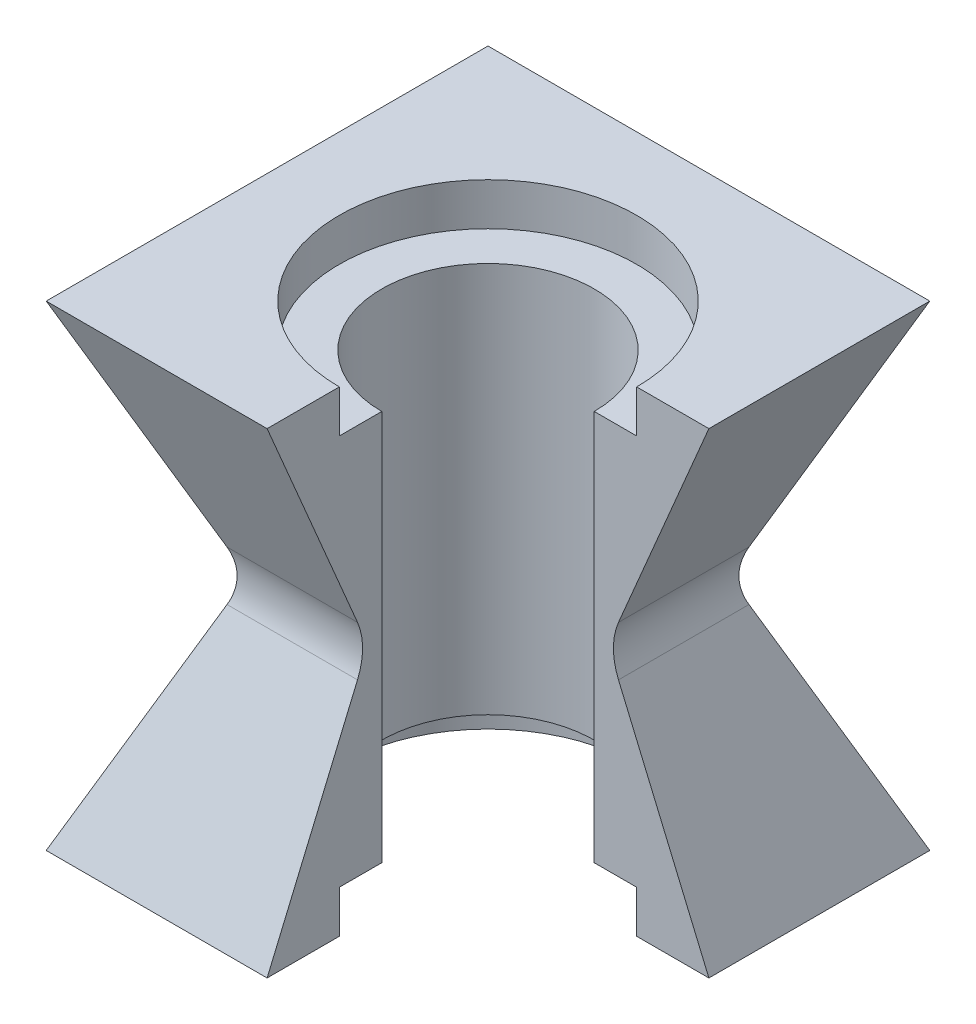
ISO-10303-21;
HEADER;
FILE_DESCRIPTION(('STEP AP214'),'2;1');
FILE_NAME('part.step','',(''),(''),'','','');
FILE_SCHEMA(('AUTOMOTIVE_DESIGN { 1 0 10303 214 1 1 1 1 }'));
ENDSEC;
DATA;
#1=APPLICATION_CONTEXT('core data for automotive mechanical design processes');
#2=APPLICATION_PROTOCOL_DEFINITION('international standard','automotive_design',2000,#1);
#3=PRODUCT_CONTEXT('',#1,'mechanical');
#4=PRODUCT('Part','Part','',(#3));
#5=PRODUCT_RELATED_PRODUCT_CATEGORY('part','',(#4));
#6=PRODUCT_DEFINITION_FORMATION('','',#4);
#7=PRODUCT_DEFINITION_CONTEXT('part definition',#1,'design');
#8=PRODUCT_DEFINITION('design','',#6,#7);
#9=PRODUCT_DEFINITION_SHAPE('','',#8);
#10=(LENGTH_UNIT() NAMED_UNIT(*) SI_UNIT(.MILLI.,.METRE.));
#11=(NAMED_UNIT(*) PLANE_ANGLE_UNIT() SI_UNIT($,.RADIAN.));
#12=(NAMED_UNIT(*) SI_UNIT($,.STERADIAN.) SOLID_ANGLE_UNIT());
#13=UNCERTAINTY_MEASURE_WITH_UNIT(LENGTH_MEASURE(1.E-05),#10,'distance_accuracy_value','');
#14=(GEOMETRIC_REPRESENTATION_CONTEXT(3) GLOBAL_UNCERTAINTY_ASSIGNED_CONTEXT((#13)) GLOBAL_UNIT_ASSIGNED_CONTEXT((#10,
#11,#12)) REPRESENTATION_CONTEXT('',''));
#15=CARTESIAN_POINT('',(0.,0.,0.));
#16=DIRECTION('',(0.,0.,1.));
#17=DIRECTION('',(1.,0.,0.));
#18=AXIS2_PLACEMENT_3D('',#15,#16,#17);
#19=CARTESIAN_POINT('',(0.,-112.,0.));
#20=DIRECTION('',(0.,1.,0.));
#21=DIRECTION('',(0.,0.,1.));
#22=AXIS2_PLACEMENT_3D('',#19,#20,#21);
#23=CYLINDRICAL_SURFACE('',#22,25.);
#24=CARTESIAN_POINT('',(0.,-102.,0.));
#25=DIRECTION('',(0.,-1.,0.));
#26=DIRECTION('',(0.,0.,-1.));
#27=AXIS2_PLACEMENT_3D('',#24,#25,#26);
#28=CIRCLE('',#27,25.);
#29=CARTESIAN_POINT('',(25.,-102.,0.));
#30=VERTEX_POINT('',#29);
#31=CARTESIAN_POINT('',(0.,-102.,25.));
#32=VERTEX_POINT('',#31);
#33=EDGE_CURVE('E318',#30,#32,#28,.F.);
#34=ORIENTED_EDGE('',*,*,#33,.F.);
#35=DIRECTION('',(0.,1.,0.));
#36=VECTOR('',#35,1.);
#37=CARTESIAN_POINT('',(25.,-112.,0.));
#38=LINE('',#37,#36);
#39=CARTESIAN_POINT('',(25.,-9.99999999999999,0.));
#40=VERTEX_POINT('',#39);
#41=EDGE_CURVE('E65',#30,#40,#38,.T.);
#42=ORIENTED_EDGE('',*,*,#41,.T.);
#43=CARTESIAN_POINT('',(0.,-9.99999999999999,0.));
#44=DIRECTION('',(0.,1.,0.));
#45=DIRECTION('',(0.,0.,1.));
#46=AXIS2_PLACEMENT_3D('',#43,#44,#45);
#47=CIRCLE('',#46,25.);
#48=CARTESIAN_POINT('',(0.,-9.99999999999999,25.));
#49=VERTEX_POINT('',#48);
#50=EDGE_CURVE('E331',#49,#40,#47,.F.);
#51=ORIENTED_EDGE('',*,*,#50,.F.);
#52=DIRECTION('',(0.,1.,0.));
#53=VECTOR('',#52,1.);
#54=CARTESIAN_POINT('',(0.,-112.,25.));
#55=LINE('',#54,#53);
#56=EDGE_CURVE('E201',#49,#32,#55,.F.);
#57=ORIENTED_EDGE('',*,*,#56,.T.);
#58=EDGE_LOOP('',(#34,#42,#51,#57));
#59=FACE_BOUND('',#58,.T.);
#60=ADVANCED_FACE('F42',(#59),#23,.F.);
#61=CARTESIAN_POINT('',(0.,-112.,52.));
#62=DIRECTION('',(-1.,0.,0.));
#63=DIRECTION('',(0.,0.,1.));
#64=AXIS2_PLACEMENT_3D('',#61,#62,#63);
#65=PLANE('',#64);
#66=DIRECTION('',(0.,-1.,0.));
#67=VECTOR('',#66,1.);
#68=CARTESIAN_POINT('',(0.,-102.,35.));
#69=LINE('',#68,#67);
#70=CARTESIAN_POINT('',(0.,-102.,35.));
#71=VERTEX_POINT('',#70);
#72=CARTESIAN_POINT('',(0.,-112.,35.));
#73=VERTEX_POINT('',#72);
#74=EDGE_CURVE('E156',#71,#73,#69,.T.);
#75=ORIENTED_EDGE('',*,*,#74,.F.);
#76=DIRECTION('',(0.,0.,1.));
#77=VECTOR('',#76,1.);
#78=CARTESIAN_POINT('',(0.,-102.,52.));
#79=LINE('',#78,#77);
#80=EDGE_CURVE('E166',#32,#71,#79,.T.);
#81=ORIENTED_EDGE('',*,*,#80,.F.);
#82=ORIENTED_EDGE('',*,*,#56,.F.);
#83=DIRECTION('',(0.,0.,-1.));
#84=VECTOR('',#83,1.);
#85=CARTESIAN_POINT('',(0.,-9.99999999999999,52.));
#86=LINE('',#85,#84);
#87=CARTESIAN_POINT('',(0.,-10.,35.));
#88=VERTEX_POINT('',#87);
#89=EDGE_CURVE('E340',#88,#49,#86,.T.);
#90=ORIENTED_EDGE('',*,*,#89,.F.);
#91=DIRECTION('',(0.,1.,0.));
#92=VECTOR('',#91,1.);
#93=CARTESIAN_POINT('',(0.,-10.,35.));
#94=LINE('',#93,#92);
#95=CARTESIAN_POINT('',(0.,0.,35.));
#96=VERTEX_POINT('',#95);
#97=EDGE_CURVE('E196',#88,#96,#94,.T.);
#98=ORIENTED_EDGE('',*,*,#97,.T.);
#99=DIRECTION('',(0.,0.,1.));
#100=VECTOR('',#99,1.);
#101=CARTESIAN_POINT('',(0.,0.,52.));
#102=LINE('',#101,#100);
#103=CARTESIAN_POINT('',(0.,0.,52.));
#104=VERTEX_POINT('',#103);
#105=EDGE_CURVE('E188',#96,#104,#102,.T.);
#106=ORIENTED_EDGE('',*,*,#105,.T.);
#107=DIRECTION('',(0.,-0.92050485345244,-0.390731128489275));
#108=VECTOR('',#107,1.);
#109=CARTESIAN_POINT('',(0.,0.,52.));
#110=LINE('',#109,#108);
#111=CARTESIAN_POINT('',(0.,-50.1390330726609,30.7172431515549));
#112=VERTEX_POINT('',#111);
#113=EDGE_CURVE('E186',#104,#112,#110,.T.);
#114=ORIENTED_EDGE('',*,*,#113,.T.);
#115=CARTESIAN_POINT('',(0.,-56.,44.5248159533415));
#116=DIRECTION('',(-1.,0.,0.));
#117=DIRECTION('',(0.,0.,1.));
#118=AXIS2_PLACEMENT_3D('',#115,#116,#117);
#119=CIRCLE('',#118,15.);
#120=CARTESIAN_POINT('',(0.,-61.8609669273391,30.7172431515549));
#121=VERTEX_POINT('',#120);
#122=EDGE_CURVE('E291',#121,#112,#119,.F.);
#123=ORIENTED_EDGE('',*,*,#122,.F.);
#124=DIRECTION('',(0.,-0.92050485345244,0.390731128489275));
#125=VECTOR('',#124,1.);
#126=CARTESIAN_POINT('',(0.,-112.,52.));
#127=LINE('',#126,#125);
#128=CARTESIAN_POINT('',(0.,-112.,52.));
#129=VERTEX_POINT('',#128);
#130=EDGE_CURVE('E180',#129,#121,#127,.F.);
#131=ORIENTED_EDGE('',*,*,#130,.F.);
#132=DIRECTION('',(0.,0.,1.));
#133=VECTOR('',#132,1.);
#134=CARTESIAN_POINT('',(0.,-112.,52.));
#135=LINE('',#134,#133);
#136=EDGE_CURVE('E172',#73,#129,#135,.T.);
#137=ORIENTED_EDGE('',*,*,#136,.F.);
#138=EDGE_LOOP('',(#75,#81,#82,#90,#98,#106,#114,#123,#131,#137));
#139=FACE_BOUND('',#138,.T.);
#140=ADVANCED_FACE('F178',(#139),#65,.F.);
#141=CARTESIAN_POINT('',(52.,-112.,0.));
#142=DIRECTION('',(0.,0.,-1.));
#143=DIRECTION('',(-1.,0.,0.));
#144=AXIS2_PLACEMENT_3D('',#141,#142,#143);
#145=PLANE('',#144);
#146=DIRECTION('',(0.,-1.,0.));
#147=VECTOR('',#146,1.);
#148=CARTESIAN_POINT('',(35.,-102.,0.));
#149=LINE('',#148,#147);
#150=CARTESIAN_POINT('',(35.,-112.,0.));
#151=VERTEX_POINT('',#150);
#152=CARTESIAN_POINT('',(35.,-102.,0.));
#153=VERTEX_POINT('',#152);
#154=EDGE_CURVE('E11',#151,#153,#149,.F.);
#155=ORIENTED_EDGE('',*,*,#154,.F.);
#156=DIRECTION('',(-1.,0.,0.));
#157=VECTOR('',#156,1.);
#158=CARTESIAN_POINT('',(52.,-112.,0.));
#159=LINE('',#158,#157);
#160=CARTESIAN_POINT('',(52.,-112.,0.));
#161=VERTEX_POINT('',#160);
#162=EDGE_CURVE('E175',#161,#151,#159,.T.);
#163=ORIENTED_EDGE('',*,*,#162,.F.);
#164=DIRECTION('',(-0.390731128489275,0.92050485345244,0.));
#165=VECTOR('',#164,1.);
#166=CARTESIAN_POINT('',(52.,-112.,0.));
#167=LINE('',#166,#165);
#168=CARTESIAN_POINT('',(30.7172431515549,-61.8609669273391,0.));
#169=VERTEX_POINT('',#168);
#170=EDGE_CURVE('E205',#169,#161,#167,.F.);
#171=ORIENTED_EDGE('',*,*,#170,.F.);
#172=CARTESIAN_POINT('',(44.5248159533415,-56.,0.));
#173=DIRECTION('',(0.,0.,-1.));
#174=DIRECTION('',(-1.,0.,0.));
#175=AXIS2_PLACEMENT_3D('',#172,#173,#174);
#176=CIRCLE('',#175,15.);
#177=CARTESIAN_POINT('',(30.7172431515549,-50.1390330726609,0.));
#178=VERTEX_POINT('',#177);
#179=EDGE_CURVE('E305',#178,#169,#176,.F.);
#180=ORIENTED_EDGE('',*,*,#179,.F.);
#181=DIRECTION('',(0.390731128489275,0.92050485345244,0.));
#182=VECTOR('',#181,1.);
#183=CARTESIAN_POINT('',(52.,0.,0.));
#184=LINE('',#183,#182);
#185=CARTESIAN_POINT('',(52.,0.,0.));
#186=VERTEX_POINT('',#185);
#187=EDGE_CURVE('E209',#178,#186,#184,.T.);
#188=ORIENTED_EDGE('',*,*,#187,.T.);
#189=DIRECTION('',(-1.,0.,0.));
#190=VECTOR('',#189,1.);
#191=CARTESIAN_POINT('',(52.,0.,0.));
#192=LINE('',#191,#190);
#193=CARTESIAN_POINT('',(35.,0.,0.));
#194=VERTEX_POINT('',#193);
#195=EDGE_CURVE('E192',#186,#194,#192,.T.);
#196=ORIENTED_EDGE('',*,*,#195,.T.);
#197=DIRECTION('',(0.,1.,0.));
#198=VECTOR('',#197,1.);
#199=CARTESIAN_POINT('',(35.,-10.,0.));
#200=LINE('',#199,#198);
#201=CARTESIAN_POINT('',(35.,-10.,0.));
#202=VERTEX_POINT('',#201);
#203=EDGE_CURVE('E312',#194,#202,#200,.F.);
#204=ORIENTED_EDGE('',*,*,#203,.T.);
#205=DIRECTION('',(1.,0.,0.));
#206=VECTOR('',#205,1.);
#207=CARTESIAN_POINT('',(52.,-9.99999999999999,0.));
#208=LINE('',#207,#206);
#209=EDGE_CURVE('E309',#40,#202,#208,.T.);
#210=ORIENTED_EDGE('',*,*,#209,.F.);
#211=ORIENTED_EDGE('',*,*,#41,.F.);
#212=DIRECTION('',(-1.,0.,0.));
#213=VECTOR('',#212,1.);
#214=CARTESIAN_POINT('',(52.,-102.,0.));
#215=LINE('',#214,#213);
#216=EDGE_CURVE('E51',#153,#30,#215,.T.);
#217=ORIENTED_EDGE('',*,*,#216,.F.);
#218=EDGE_LOOP('',(#155,#163,#171,#180,#188,#196,#204,#210,#211,#217));
#219=FACE_BOUND('',#218,.T.);
#220=ADVANCED_FACE('F324',(#219),#145,.F.);
#221=CARTESIAN_POINT('',(52.,0.,-52.));
#222=DIRECTION('',(0.92050485345244,-0.390731128489275,0.));
#223=DIRECTION('',(0.390731128489275,0.92050485345244,0.));
#224=AXIS2_PLACEMENT_3D('',#221,#222,#223);
#225=PLANE('',#224);
#226=ORIENTED_EDGE('',*,*,#187,.F.);
#227=DIRECTION('',(0.,0.,1.));
#228=VECTOR('',#227,1.);
#229=CARTESIAN_POINT('',(30.7172431515549,-50.1390330726609,-52.));
#230=LINE('',#229,#228);
#231=CARTESIAN_POINT('',(30.7172431515549,-50.1390330726609,-30.7172431515549));
#232=VERTEX_POINT('',#231);
#233=EDGE_CURVE('E272',#178,#232,#230,.F.);
#234=ORIENTED_EDGE('',*,*,#233,.T.);
#235=DIRECTION('',(0.363936289648103,0.8573801689766,-0.363936289648103));
#236=VECTOR('',#235,1.);
#237=CARTESIAN_POINT('',(52.,0.,-52.));
#238=LINE('',#237,#236);
#239=CARTESIAN_POINT('',(52.,0.,-52.));
#240=VERTEX_POINT('',#239);
#241=EDGE_CURVE('E255',#232,#240,#238,.T.);
#242=ORIENTED_EDGE('',*,*,#241,.T.);
#243=DIRECTION('',(0.,0.,-1.));
#244=VECTOR('',#243,1.);
#245=CARTESIAN_POINT('',(52.,0.,-52.));
#246=LINE('',#245,#244);
#247=EDGE_CURVE('E235',#186,#240,#246,.T.);
#248=ORIENTED_EDGE('',*,*,#247,.F.);
#249=EDGE_LOOP('',(#226,#234,#242,#248));
#250=FACE_BOUND('',#249,.T.);
#251=ADVANCED_FACE('F388',(#250),#225,.T.);
#252=CARTESIAN_POINT('',(-52.,0.,52.));
#253=DIRECTION('',(0.,-0.390731128489275,0.92050485345244));
#254=DIRECTION('',(0.,-0.92050485345244,-0.390731128489275));
#255=AXIS2_PLACEMENT_3D('',#252,#253,#254);
#256=PLANE('',#255);
#257=ORIENTED_EDGE('',*,*,#113,.F.);
#258=DIRECTION('',(1.,0.,0.));
#259=VECTOR('',#258,1.);
#260=CARTESIAN_POINT('',(-52.,0.,52.));
#261=LINE('',#260,#259);
#262=CARTESIAN_POINT('',(-52.,0.,52.));
#263=VERTEX_POINT('',#262);
#264=EDGE_CURVE('E251',#263,#104,#261,.T.);
#265=ORIENTED_EDGE('',*,*,#264,.F.);
#266=DIRECTION('',(-0.363936289648103,0.8573801689766,0.363936289648103));
#267=VECTOR('',#266,1.);
#268=CARTESIAN_POINT('',(-38.2252392160259,-32.4513027815816,38.2252392160259));
#269=LINE('',#268,#267);
#270=CARTESIAN_POINT('',(-30.7172431515549,-50.1390330726609,30.7172431515549));
#271=VERTEX_POINT('',#270);
#272=EDGE_CURVE('E262',#271,#263,#269,.T.);
#273=ORIENTED_EDGE('',*,*,#272,.F.);
#274=DIRECTION('',(-1.,0.,0.));
#275=VECTOR('',#274,1.);
#276=CARTESIAN_POINT('',(-52.,-50.1390330726609,30.7172431515549));
#277=LINE('',#276,#275);
#278=EDGE_CURVE('E265',#271,#112,#277,.F.);
#279=ORIENTED_EDGE('',*,*,#278,.T.);
#280=EDGE_LOOP('',(#257,#265,#273,#279));
#281=FACE_BOUND('',#280,.T.);
#282=ADVANCED_FACE('F356',(#281),#256,.T.);
#283=CARTESIAN_POINT('',(-52.,0.,-52.));
#284=DIRECTION('',(-0.92050485345244,-0.390731128489275,0.));
#285=DIRECTION('',(0.390731128489275,-0.92050485345244,0.));
#286=AXIS2_PLACEMENT_3D('',#283,#284,#285);
#287=PLANE('',#286);
#288=DIRECTION('',(-0.363936289648103,0.8573801689766,-0.363936289648103));
#289=VECTOR('',#288,1.);
#290=CARTESIAN_POINT('',(-52.,0.,-52.));
#291=LINE('',#290,#289);
#292=CARTESIAN_POINT('',(-30.7172431515549,-50.1390330726609,-30.7172431515549));
#293=VERTEX_POINT('',#292);
#294=CARTESIAN_POINT('',(-52.,0.,-52.));
#295=VERTEX_POINT('',#294);
#296=EDGE_CURVE('E259',#293,#295,#291,.T.);
#297=ORIENTED_EDGE('',*,*,#296,.F.);
#298=DIRECTION('',(0.,0.,-1.));
#299=VECTOR('',#298,1.);
#300=CARTESIAN_POINT('',(-30.717243151555,-50.1390330726609,-52.));
#301=LINE('',#300,#299);
#302=EDGE_CURVE('E285',#293,#271,#301,.F.);
#303=ORIENTED_EDGE('',*,*,#302,.T.);
#304=ORIENTED_EDGE('',*,*,#272,.T.);
#305=DIRECTION('',(0.,0.,1.));
#306=VECTOR('',#305,1.);
#307=CARTESIAN_POINT('',(-52.,0.,-52.));
#308=LINE('',#307,#306);
#309=EDGE_CURVE('E247',#295,#263,#308,.T.);
#310=ORIENTED_EDGE('',*,*,#309,.F.);
#311=EDGE_LOOP('',(#297,#303,#304,#310));
#312=FACE_BOUND('',#311,.T.);
#313=ADVANCED_FACE('F395',(#312),#287,.T.);
#314=CARTESIAN_POINT('',(-52.,0.,-52.));
#315=DIRECTION('',(0.,-0.390731128489275,-0.92050485345244));
#316=DIRECTION('',(0.,0.92050485345244,-0.390731128489275));
#317=AXIS2_PLACEMENT_3D('',#314,#315,#316);
#318=PLANE('',#317);
#319=ORIENTED_EDGE('',*,*,#241,.F.);
#320=DIRECTION('',(1.,0.,0.));
#321=VECTOR('',#320,1.);
#322=CARTESIAN_POINT('',(-52.,-50.1390330726609,-30.7172431515549));
#323=LINE('',#322,#321);
#324=EDGE_CURVE('E279',#232,#293,#323,.F.);
#325=ORIENTED_EDGE('',*,*,#324,.T.);
#326=ORIENTED_EDGE('',*,*,#296,.T.);
#327=DIRECTION('',(-1.,0.,0.));
#328=VECTOR('',#327,1.);
#329=CARTESIAN_POINT('',(-52.,0.,-52.));
#330=LINE('',#329,#328);
#331=EDGE_CURVE('E243',#240,#295,#330,.T.);
#332=ORIENTED_EDGE('',*,*,#331,.F.);
#333=EDGE_LOOP('',(#319,#325,#326,#332));
#334=FACE_BOUND('',#333,.T.);
#335=ADVANCED_FACE('F392',(#334),#318,.T.);
#336=CARTESIAN_POINT('',(0.,0.,0.));
#337=DIRECTION('',(0.,1.,0.));
#338=DIRECTION('',(0.,0.,1.));
#339=AXIS2_PLACEMENT_3D('',#336,#337,#338);
#340=PLANE('',#339);
#341=CARTESIAN_POINT('',(0.,0.,0.));
#342=DIRECTION('',(0.,1.,0.));
#343=DIRECTION('',(0.,0.,1.));
#344=AXIS2_PLACEMENT_3D('',#341,#342,#343);
#345=CIRCLE('',#344,35.);
#346=EDGE_CURVE('E165',#194,#96,#345,.T.);
#347=ORIENTED_EDGE('',*,*,#346,.F.);
#348=ORIENTED_EDGE('',*,*,#195,.F.);
#349=ORIENTED_EDGE('',*,*,#247,.T.);
#350=ORIENTED_EDGE('',*,*,#331,.T.);
#351=ORIENTED_EDGE('',*,*,#309,.T.);
#352=ORIENTED_EDGE('',*,*,#264,.T.);
#353=ORIENTED_EDGE('',*,*,#105,.F.);
#354=EDGE_LOOP('',(#347,#348,#349,#350,#351,#352,#353));
#355=FACE_BOUND('',#354,.T.);
#356=ADVANCED_FACE('F350',(#355),#340,.T.);
#357=CARTESIAN_POINT('',(52.,-112.,-52.));
#358=DIRECTION('',(0.92050485345244,0.390731128489275,0.));
#359=DIRECTION('',(-0.390731128489275,0.92050485345244,0.));
#360=AXIS2_PLACEMENT_3D('',#357,#358,#359);
#361=PLANE('',#360);
#362=DIRECTION('',(0.,0.,-1.));
#363=VECTOR('',#362,1.);
#364=CARTESIAN_POINT('',(30.7172431515549,-61.8609669273391,-52.));
#365=LINE('',#364,#363);
#366=CARTESIAN_POINT('',(30.7172431515549,-61.8609669273391,-30.7172431515549));
#367=VERTEX_POINT('',#366);
#368=EDGE_CURVE('E275',#367,#169,#365,.F.);
#369=ORIENTED_EDGE('',*,*,#368,.T.);
#370=ORIENTED_EDGE('',*,*,#170,.T.);
#371=DIRECTION('',(0.,0.,-1.));
#372=VECTOR('',#371,1.);
#373=CARTESIAN_POINT('',(52.,-112.,-52.));
#374=LINE('',#373,#372);
#375=CARTESIAN_POINT('',(52.,-112.,-52.));
#376=VERTEX_POINT('',#375);
#377=EDGE_CURVE('E215',#161,#376,#374,.T.);
#378=ORIENTED_EDGE('',*,*,#377,.T.);
#379=DIRECTION('',(0.363936289648103,-0.8573801689766,-0.363936289648103));
#380=VECTOR('',#379,1.);
#381=CARTESIAN_POINT('',(38.2252392160259,-79.5486972184184,-38.2252392160259));
#382=LINE('',#381,#380);
#383=EDGE_CURVE('E231',#367,#376,#382,.T.);
#384=ORIENTED_EDGE('',*,*,#383,.F.);
#385=EDGE_LOOP('',(#369,#370,#378,#384));
#386=FACE_BOUND('',#385,.T.);
#387=ADVANCED_FACE('F377',(#386),#361,.T.);
#388=CARTESIAN_POINT('',(-52.,-112.,-52.));
#389=DIRECTION('',(0.,0.390731128489275,-0.92050485345244));
#390=DIRECTION('',(0.,0.92050485345244,0.390731128489275));
#391=AXIS2_PLACEMENT_3D('',#388,#389,#390);
#392=PLANE('',#391);
#393=DIRECTION('',(-0.363936289648103,-0.8573801689766,-0.363936289648103));
#394=VECTOR('',#393,1.);
#395=CARTESIAN_POINT('',(-52.,-112.,-52.));
#396=LINE('',#395,#394);
#397=CARTESIAN_POINT('',(-30.7172431515549,-61.8609669273391,-30.7172431515549));
#398=VERTEX_POINT('',#397);
#399=CARTESIAN_POINT('',(-52.,-112.,-52.));
#400=VERTEX_POINT('',#399);
#401=EDGE_CURVE('E236',#398,#400,#396,.T.);
#402=ORIENTED_EDGE('',*,*,#401,.F.);
#403=DIRECTION('',(-1.,0.,0.));
#404=VECTOR('',#403,1.);
#405=CARTESIAN_POINT('',(-52.,-61.8609669273391,-30.7172431515549));
#406=LINE('',#405,#404);
#407=EDGE_CURVE('E282',#398,#367,#406,.F.);
#408=ORIENTED_EDGE('',*,*,#407,.T.);
#409=ORIENTED_EDGE('',*,*,#383,.T.);
#410=DIRECTION('',(-1.,0.,0.));
#411=VECTOR('',#410,1.);
#412=CARTESIAN_POINT('',(-52.,-112.,-52.));
#413=LINE('',#412,#411);
#414=EDGE_CURVE('E226',#376,#400,#413,.T.);
#415=ORIENTED_EDGE('',*,*,#414,.T.);
#416=EDGE_LOOP('',(#402,#408,#409,#415));
#417=FACE_BOUND('',#416,.T.);
#418=ADVANCED_FACE('F373',(#417),#392,.T.);
#419=CARTESIAN_POINT('',(-52.,-112.,-52.));
#420=DIRECTION('',(-0.92050485345244,0.390731128489275,0.));
#421=DIRECTION('',(-0.390731128489275,-0.92050485345244,0.));
#422=AXIS2_PLACEMENT_3D('',#419,#420,#421);
#423=PLANE('',#422);
#424=DIRECTION('',(-0.363936289648103,-0.8573801689766,0.363936289648103));
#425=VECTOR('',#424,1.);
#426=CARTESIAN_POINT('',(-52.,-112.,52.));
#427=LINE('',#426,#425);
#428=CARTESIAN_POINT('',(-30.7172431515549,-61.8609669273391,30.7172431515549));
#429=VERTEX_POINT('',#428);
#430=CARTESIAN_POINT('',(-52.,-112.,52.));
#431=VERTEX_POINT('',#430);
#432=EDGE_CURVE('E230',#429,#431,#427,.T.);
#433=ORIENTED_EDGE('',*,*,#432,.F.);
#434=DIRECTION('',(0.,0.,1.));
#435=VECTOR('',#434,1.);
#436=CARTESIAN_POINT('',(-30.717243151555,-61.8609669273391,-52.));
#437=LINE('',#436,#435);
#438=EDGE_CURVE('E288',#429,#398,#437,.F.);
#439=ORIENTED_EDGE('',*,*,#438,.T.);
#440=ORIENTED_EDGE('',*,*,#401,.T.);
#441=DIRECTION('',(0.,0.,1.));
#442=VECTOR('',#441,1.);
#443=CARTESIAN_POINT('',(-52.,-112.,-52.));
#444=LINE('',#443,#442);
#445=EDGE_CURVE('E222',#400,#431,#444,.T.);
#446=ORIENTED_EDGE('',*,*,#445,.T.);
#447=EDGE_LOOP('',(#433,#439,#440,#446));
#448=FACE_BOUND('',#447,.T.);
#449=ADVANCED_FACE('F369',(#448),#423,.T.);
#450=CARTESIAN_POINT('',(-52.,-112.,52.));
#451=DIRECTION('',(0.,0.390731128489275,0.92050485345244));
#452=DIRECTION('',(0.,-0.92050485345244,0.390731128489275));
#453=AXIS2_PLACEMENT_3D('',#450,#451,#452);
#454=PLANE('',#453);
#455=DIRECTION('',(1.,0.,0.));
#456=VECTOR('',#455,1.);
#457=CARTESIAN_POINT('',(-52.,-112.,52.));
#458=LINE('',#457,#456);
#459=EDGE_CURVE('E218',#431,#129,#458,.T.);
#460=ORIENTED_EDGE('',*,*,#459,.T.);
#461=ORIENTED_EDGE('',*,*,#130,.T.);
#462=DIRECTION('',(1.,0.,0.));
#463=VECTOR('',#462,1.);
#464=CARTESIAN_POINT('',(-52.,-61.8609669273391,30.7172431515549));
#465=LINE('',#464,#463);
#466=EDGE_CURVE('E269',#121,#429,#465,.F.);
#467=ORIENTED_EDGE('',*,*,#466,.T.);
#468=ORIENTED_EDGE('',*,*,#432,.T.);
#469=EDGE_LOOP('',(#460,#461,#467,#468));
#470=FACE_BOUND('',#469,.T.);
#471=ADVANCED_FACE('F364',(#470),#454,.T.);
#472=CARTESIAN_POINT('',(0.,-112.,0.));
#473=DIRECTION('',(0.,-1.,0.));
#474=DIRECTION('',(0.,0.,1.));
#475=AXIS2_PLACEMENT_3D('',#472,#473,#474);
#476=PLANE('',#475);
#477=ORIENTED_EDGE('',*,*,#162,.T.);
#478=CARTESIAN_POINT('',(0.,-112.,0.));
#479=DIRECTION('',(0.,1.,0.));
#480=DIRECTION('',(0.,0.,1.));
#481=AXIS2_PLACEMENT_3D('',#478,#479,#480);
#482=CIRCLE('',#481,35.);
#483=EDGE_CURVE('E159',#151,#73,#482,.T.);
#484=ORIENTED_EDGE('',*,*,#483,.T.);
#485=ORIENTED_EDGE('',*,*,#136,.T.);
#486=ORIENTED_EDGE('',*,*,#459,.F.);
#487=ORIENTED_EDGE('',*,*,#445,.F.);
#488=ORIENTED_EDGE('',*,*,#414,.F.);
#489=ORIENTED_EDGE('',*,*,#377,.F.);
#490=EDGE_LOOP('',(#477,#484,#485,#486,#487,#488,#489));
#491=FACE_BOUND('',#490,.T.);
#492=ADVANCED_FACE('F170',(#491),#476,.T.);
#493=CARTESIAN_POINT('',(-52.,-56.,-44.5248159533415));
#494=DIRECTION('',(1.,0.,0.));
#495=DIRECTION('',(0.,0.,-1.));
#496=AXIS2_PLACEMENT_3D('',#493,#494,#495);
#497=CYLINDRICAL_SURFACE('',#496,15.);
#498=CARTESIAN_POINT('',(44.5248159533415,-56.,-44.5248159533415));
#499=DIRECTION('',(0.707106781186548,0.,0.707106781186547));
#500=DIRECTION('',(0.707106781186547,0.,-0.707106781186548));
#501=AXIS2_PLACEMENT_3D('',#498,#499,#500);
#502=ELLIPSE('',#501,21.2132034355964,15.);
#503=EDGE_CURVE('E295',#367,#232,#502,.F.);
#504=ORIENTED_EDGE('',*,*,#503,.F.);
#505=ORIENTED_EDGE('',*,*,#407,.F.);
#506=CARTESIAN_POINT('',(-44.5248159533416,-56.,-44.5248159533415));
#507=DIRECTION('',(0.707106781186547,0.,-0.707106781186548));
#508=DIRECTION('',(-0.707106781186548,0.,-0.707106781186547));
#509=AXIS2_PLACEMENT_3D('',#506,#507,#508);
#510=ELLIPSE('',#509,21.2132034355964,15.);
#511=EDGE_CURVE('E219',#293,#398,#510,.T.);
#512=ORIENTED_EDGE('',*,*,#511,.F.);
#513=ORIENTED_EDGE('',*,*,#324,.F.);
#514=EDGE_LOOP('',(#504,#505,#512,#513));
#515=FACE_BOUND('',#514,.T.);
#516=ADVANCED_FACE('F44',(#515),#497,.F.);
#517=CARTESIAN_POINT('',(-44.5248159533416,-56.,-52.));
#518=DIRECTION('',(0.,0.,-1.));
#519=DIRECTION('',(-1.,0.,0.));
#520=AXIS2_PLACEMENT_3D('',#517,#518,#519);
#521=CYLINDRICAL_SURFACE('',#520,15.);
#522=ORIENTED_EDGE('',*,*,#511,.T.);
#523=ORIENTED_EDGE('',*,*,#438,.F.);
#524=CARTESIAN_POINT('',(-44.5248159533415,-56.,44.5248159533415));
#525=DIRECTION('',(-0.707106781186548,0.,-0.707106781186547));
#526=DIRECTION('',(0.707106781186547,0.,-0.707106781186548));
#527=AXIS2_PLACEMENT_3D('',#524,#525,#526);
#528=ELLIPSE('',#527,21.2132034355964,15.);
#529=EDGE_CURVE('E214',#271,#429,#528,.T.);
#530=ORIENTED_EDGE('',*,*,#529,.F.);
#531=ORIENTED_EDGE('',*,*,#302,.F.);
#532=EDGE_LOOP('',(#522,#523,#530,#531));
#533=FACE_BOUND('',#532,.T.);
#534=ADVANCED_FACE('F398',(#533),#521,.F.);
#535=CARTESIAN_POINT('',(44.5248159533415,-56.,-52.));
#536=DIRECTION('',(0.,0.,1.));
#537=DIRECTION('',(1.,0.,0.));
#538=AXIS2_PLACEMENT_3D('',#535,#536,#537);
#539=CYLINDRICAL_SURFACE('',#538,15.);
#540=ORIENTED_EDGE('',*,*,#233,.F.);
#541=ORIENTED_EDGE('',*,*,#179,.T.);
#542=ORIENTED_EDGE('',*,*,#368,.F.);
#543=ORIENTED_EDGE('',*,*,#503,.T.);
#544=EDGE_LOOP('',(#540,#541,#542,#543));
#545=FACE_BOUND('',#544,.T.);
#546=ADVANCED_FACE('F384',(#545),#539,.F.);
#547=CARTESIAN_POINT('',(-52.,-56.,44.5248159533415));
#548=DIRECTION('',(-1.,0.,0.));
#549=DIRECTION('',(0.,0.,1.));
#550=AXIS2_PLACEMENT_3D('',#547,#548,#549);
#551=CYLINDRICAL_SURFACE('',#550,15.);
#552=ORIENTED_EDGE('',*,*,#466,.F.);
#553=ORIENTED_EDGE('',*,*,#122,.T.);
#554=ORIENTED_EDGE('',*,*,#278,.F.);
#555=ORIENTED_EDGE('',*,*,#529,.T.);
#556=EDGE_LOOP('',(#552,#553,#554,#555));
#557=FACE_BOUND('',#556,.T.);
#558=ADVANCED_FACE('F361',(#557),#551,.F.);
#559=CARTESIAN_POINT('',(0.,-10.,0.));
#560=DIRECTION('',(0.,1.,0.));
#561=DIRECTION('',(0.,0.,1.));
#562=AXIS2_PLACEMENT_3D('',#559,#560,#561);
#563=CYLINDRICAL_SURFACE('',#562,35.);
#564=CARTESIAN_POINT('',(0.,-10.,0.));
#565=DIRECTION('',(0.,1.,0.));
#566=DIRECTION('',(0.,0.,1.));
#567=AXIS2_PLACEMENT_3D('',#564,#565,#566);
#568=CIRCLE('',#567,35.);
#569=EDGE_CURVE('E329',#202,#88,#568,.T.);
#570=ORIENTED_EDGE('',*,*,#569,.F.);
#571=ORIENTED_EDGE('',*,*,#203,.F.);
#572=ORIENTED_EDGE('',*,*,#346,.T.);
#573=ORIENTED_EDGE('',*,*,#97,.F.);
#574=EDGE_LOOP('',(#570,#571,#572,#573));
#575=FACE_BOUND('',#574,.T.);
#576=ADVANCED_FACE('F333',(#575),#563,.F.);
#577=CARTESIAN_POINT('',(0.,-10.,0.));
#578=DIRECTION('',(0.,1.,0.));
#579=DIRECTION('',(0.,0.,1.));
#580=AXIS2_PLACEMENT_3D('',#577,#578,#579);
#581=PLANE('',#580);
#582=ORIENTED_EDGE('',*,*,#89,.T.);
#583=ORIENTED_EDGE('',*,*,#50,.T.);
#584=ORIENTED_EDGE('',*,*,#209,.T.);
#585=ORIENTED_EDGE('',*,*,#569,.T.);
#586=EDGE_LOOP('',(#582,#583,#584,#585));
#587=FACE_BOUND('',#586,.T.);
#588=ADVANCED_FACE('F328',(#587),#581,.T.);
#589=CARTESIAN_POINT('',(0.,-102.,0.));
#590=DIRECTION('',(0.,-1.,0.));
#591=DIRECTION('',(0.,0.,-1.));
#592=AXIS2_PLACEMENT_3D('',#589,#590,#591);
#593=CYLINDRICAL_SURFACE('',#592,35.);
#594=ORIENTED_EDGE('',*,*,#74,.T.);
#595=ORIENTED_EDGE('',*,*,#483,.F.);
#596=ORIENTED_EDGE('',*,*,#154,.T.);
#597=CARTESIAN_POINT('',(0.,-102.,0.));
#598=DIRECTION('',(0.,1.,0.));
#599=DIRECTION('',(0.,0.,1.));
#600=AXIS2_PLACEMENT_3D('',#597,#598,#599);
#601=CIRCLE('',#600,35.);
#602=EDGE_CURVE('E58',#153,#71,#601,.T.);
#603=ORIENTED_EDGE('',*,*,#602,.T.);
#604=EDGE_LOOP('',(#594,#595,#596,#603));
#605=FACE_BOUND('',#604,.T.);
#606=ADVANCED_FACE('F158',(#605),#593,.F.);
#607=CARTESIAN_POINT('',(0.,-102.,0.));
#608=DIRECTION('',(0.,-1.,0.));
#609=DIRECTION('',(0.,0.,1.));
#610=AXIS2_PLACEMENT_3D('',#607,#608,#609);
#611=PLANE('',#610);
#612=ORIENTED_EDGE('',*,*,#80,.T.);
#613=ORIENTED_EDGE('',*,*,#602,.F.);
#614=ORIENTED_EDGE('',*,*,#216,.T.);
#615=ORIENTED_EDGE('',*,*,#33,.T.);
#616=EDGE_LOOP('',(#612,#613,#614,#615));
#617=FACE_BOUND('',#616,.T.);
#618=ADVANCED_FACE('F317',(#617),#611,.T.);
#619=CLOSED_SHELL('',(#60,#140,#220,#251,#282,#313,#335,#356,#387,#418,#449,#471,#492,#516,#534,
#546,#558,#576,#588,#606,#618));
#620=MANIFOLD_SOLID_BREP('B2',#619);
#621=ADVANCED_BREP_SHAPE_REPRESENTATION('',(#18,#620),#14);
#622=SHAPE_DEFINITION_REPRESENTATION(#9,#621);
ENDSEC;
END-ISO-10303-21;
